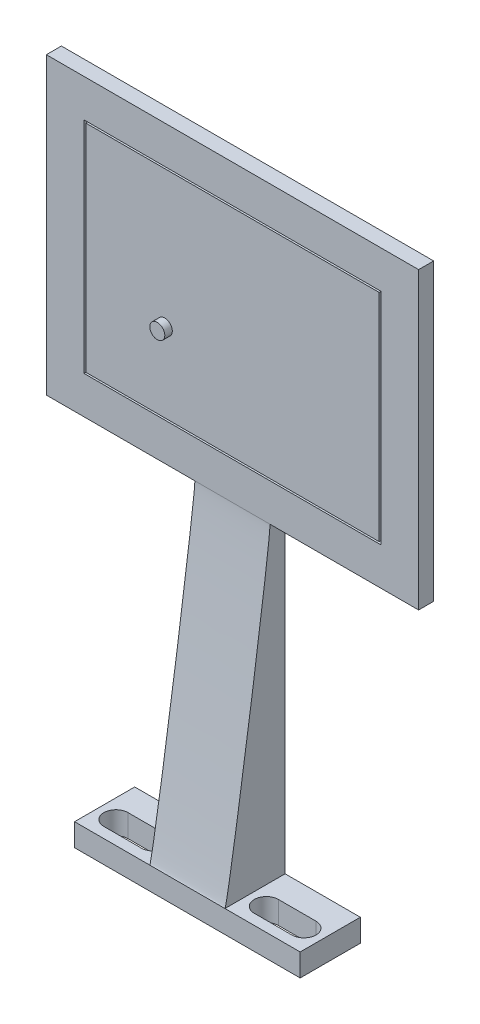
ISO-10303-21;
HEADER;
FILE_DESCRIPTION(('STEP AP214'),'2;1');
FILE_NAME('part.step','',(''),(''),'','','');
FILE_SCHEMA(('AUTOMOTIVE_DESIGN { 1 0 10303 214 1 1 1 1 }'));
ENDSEC;
DATA;
#1=APPLICATION_CONTEXT('core data for automotive mechanical design processes');
#2=APPLICATION_PROTOCOL_DEFINITION('international standard','automotive_design',2000,#1);
#3=PRODUCT_CONTEXT('',#1,'mechanical');
#4=PRODUCT('Part','Part','',(#3));
#5=PRODUCT_RELATED_PRODUCT_CATEGORY('part','',(#4));
#6=PRODUCT_DEFINITION_FORMATION('','',#4);
#7=PRODUCT_DEFINITION_CONTEXT('part definition',#1,'design');
#8=PRODUCT_DEFINITION('design','',#6,#7);
#9=PRODUCT_DEFINITION_SHAPE('','',#8);
#10=(LENGTH_UNIT() NAMED_UNIT(*) SI_UNIT(.MILLI.,.METRE.));
#11=(NAMED_UNIT(*) PLANE_ANGLE_UNIT() SI_UNIT($,.RADIAN.));
#12=(NAMED_UNIT(*) SI_UNIT($,.STERADIAN.) SOLID_ANGLE_UNIT());
#13=UNCERTAINTY_MEASURE_WITH_UNIT(LENGTH_MEASURE(1.E-05),#10,'distance_accuracy_value','');
#14=(GEOMETRIC_REPRESENTATION_CONTEXT(3) GLOBAL_UNCERTAINTY_ASSIGNED_CONTEXT((#13)) GLOBAL_UNIT_ASSIGNED_CONTEXT((#10,
#11,#12)) REPRESENTATION_CONTEXT('',''));
#15=CARTESIAN_POINT('',(0.,0.,0.));
#16=DIRECTION('',(0.,0.,1.));
#17=DIRECTION('',(1.,0.,0.));
#18=AXIS2_PLACEMENT_3D('',#15,#16,#17);
#19=CARTESIAN_POINT('',(0.,-75.2,0.));
#20=DIRECTION('',(0.,-1.,0.));
#21=DIRECTION('',(0.,0.,-1.));
#22=AXIS2_PLACEMENT_3D('',#19,#20,#21);
#23=PLANE('',#22);
#24=DIRECTION('',(-1.,0.,0.));
#25=VECTOR('',#24,1.);
#26=CARTESIAN_POINT('',(0.,-75.2,2.9));
#27=LINE('',#26,#25);
#28=CARTESIAN_POINT('',(12.,-75.2,2.9));
#29=VERTEX_POINT('',#28);
#30=CARTESIAN_POINT('',(7.00000000000001,-75.2,2.9));
#31=VERTEX_POINT('',#30);
#32=EDGE_CURVE('E556',#29,#31,#27,.T.);
#33=ORIENTED_EDGE('',*,*,#32,.F.);
#34=CARTESIAN_POINT('',(12.,-75.2,4.5));
#35=DIRECTION('',(0.,-1.,0.));
#36=DIRECTION('',(0.,0.,-1.));
#37=AXIS2_PLACEMENT_3D('',#34,#35,#36);
#38=CIRCLE('',#37,1.6);
#39=CARTESIAN_POINT('',(12.,-75.2,6.1));
#40=VERTEX_POINT('',#39);
#41=EDGE_CURVE('E264',#40,#29,#38,.F.);
#42=ORIENTED_EDGE('',*,*,#41,.F.);
#43=DIRECTION('',(1.,0.,0.));
#44=VECTOR('',#43,1.);
#45=CARTESIAN_POINT('',(0.,-75.2,6.1));
#46=LINE('',#45,#44);
#47=CARTESIAN_POINT('',(7.,-75.2,6.1));
#48=VERTEX_POINT('',#47);
#49=EDGE_CURVE('E576',#48,#40,#46,.T.);
#50=ORIENTED_EDGE('',*,*,#49,.F.);
#51=CARTESIAN_POINT('',(7.,-75.2,4.5));
#52=DIRECTION('',(0.,-1.,0.));
#53=DIRECTION('',(0.,0.,-1.));
#54=AXIS2_PLACEMENT_3D('',#51,#52,#53);
#55=CIRCLE('',#54,1.6);
#56=EDGE_CURVE('E579',#48,#31,#55,.T.);
#57=ORIENTED_EDGE('',*,*,#56,.T.);
#58=EDGE_LOOP('',(#33,#42,#50,#57));
#59=FACE_BOUND('',#58,.T.);
#60=DIRECTION('',(1.,0.,0.));
#61=VECTOR('',#60,1.);
#62=CARTESIAN_POINT('',(0.,-75.2,7.5));
#63=LINE('',#62,#61);
#64=CARTESIAN_POINT('',(4.5,-75.2,7.5));
#65=VERTEX_POINT('',#64);
#66=CARTESIAN_POINT('',(14.5,-75.2,7.5));
#67=VERTEX_POINT('',#66);
#68=EDGE_CURVE('E335',#65,#67,#63,.T.);
#69=ORIENTED_EDGE('',*,*,#68,.T.);
#70=DIRECTION('',(0.,0.,-1.));
#71=VECTOR('',#70,1.);
#72=CARTESIAN_POINT('',(14.5,-75.2,1.5));
#73=LINE('',#72,#71);
#74=CARTESIAN_POINT('',(14.5,-75.2,-0.5));
#75=VERTEX_POINT('',#74);
#76=EDGE_CURVE('E111',#67,#75,#73,.T.);
#77=ORIENTED_EDGE('',*,*,#76,.T.);
#78=DIRECTION('',(1.,0.,0.));
#79=VECTOR('',#78,1.);
#80=CARTESIAN_POINT('',(0.,-75.2,-0.5));
#81=LINE('',#80,#79);
#82=CARTESIAN_POINT('',(4.5,-75.2,-0.5));
#83=VERTEX_POINT('',#82);
#84=EDGE_CURVE('E319',#83,#75,#81,.T.);
#85=ORIENTED_EDGE('',*,*,#84,.F.);
#86=DIRECTION('',(0.,0.,-1.));
#87=VECTOR('',#86,1.);
#88=CARTESIAN_POINT('',(4.50000000000001,-75.2,0.));
#89=LINE('',#88,#87);
#90=EDGE_CURVE('E329',#65,#83,#89,.T.);
#91=ORIENTED_EDGE('',*,*,#90,.F.);
#92=EDGE_LOOP('',(#69,#77,#85,#91));
#93=FACE_BOUND('',#92,.T.);
#94=ADVANCED_FACE('F83',(#59,#93),#23,.F.);
#95=CARTESIAN_POINT('',(0.,-33.95,-0.5));
#96=DIRECTION('',(0.,-1.,0.));
#97=DIRECTION('',(0.,0.,-1.));
#98=AXIS2_PLACEMENT_3D('',#95,#96,#97);
#99=PLANE('',#98);
#100=DIRECTION('',(0.,0.,-1.));
#101=VECTOR('',#100,1.);
#102=CARTESIAN_POINT('',(14.5,-33.95,1.5));
#103=LINE('',#102,#101);
#104=CARTESIAN_POINT('',(14.5,-33.95,1.5));
#105=VERTEX_POINT('',#104);
#106=CARTESIAN_POINT('',(14.5,-33.95,-0.5));
#107=VERTEX_POINT('',#106);
#108=EDGE_CURVE('E402',#105,#107,#103,.T.);
#109=ORIENTED_EDGE('',*,*,#108,.F.);
#110=DIRECTION('',(1.,0.,0.));
#111=VECTOR('',#110,1.);
#112=CARTESIAN_POINT('',(0.,-33.95,1.5));
#113=LINE('',#112,#111);
#114=CARTESIAN_POINT('',(-5.25,-33.95,1.5));
#115=VERTEX_POINT('',#114);
#116=EDGE_CURVE('E386',#115,#105,#113,.T.);
#117=ORIENTED_EDGE('',*,*,#116,.F.);
#118=DIRECTION('',(0.,0.,1.));
#119=VECTOR('',#118,1.);
#120=CARTESIAN_POINT('',(-5.25,-33.95,-0.5));
#121=LINE('',#120,#119);
#122=CARTESIAN_POINT('',(-5.25,-33.95,-0.5));
#123=VERTEX_POINT('',#122);
#124=EDGE_CURVE('E348',#123,#115,#121,.T.);
#125=ORIENTED_EDGE('',*,*,#124,.F.);
#126=DIRECTION('',(1.,0.,0.));
#127=VECTOR('',#126,1.);
#128=CARTESIAN_POINT('',(0.,-33.95,-0.5));
#129=LINE('',#128,#127);
#130=EDGE_CURVE('E503',#123,#107,#129,.T.);
#131=ORIENTED_EDGE('',*,*,#130,.T.);
#132=EDGE_LOOP('',(#109,#117,#125,#131));
#133=FACE_BOUND('',#132,.T.);
#134=ADVANCED_FACE('F539',(#133),#99,.T.);
#135=CARTESIAN_POINT('',(0.,0.25,-0.5));
#136=DIRECTION('',(0.,-1.,0.));
#137=DIRECTION('',(0.,0.,-1.));
#138=AXIS2_PLACEMENT_3D('',#135,#136,#137);
#139=PLANE('',#138);
#140=DIRECTION('',(1.,0.,0.));
#141=VECTOR('',#140,1.);
#142=CARTESIAN_POINT('',(0.,0.25,1.5));
#143=LINE('',#142,#141);
#144=CARTESIAN_POINT('',(-0.25,0.25,1.5));
#145=VERTEX_POINT('',#144);
#146=CARTESIAN_POINT('',(39.25,0.25,1.5));
#147=VERTEX_POINT('',#146);
#148=EDGE_CURVE('E382',#145,#147,#143,.T.);
#149=ORIENTED_EDGE('',*,*,#148,.F.);
#150=DIRECTION('',(0.,0.,1.));
#151=VECTOR('',#150,1.);
#152=CARTESIAN_POINT('',(-0.25,0.25,-0.5));
#153=LINE('',#152,#151);
#154=CARTESIAN_POINT('',(-0.25,0.25,-0.5));
#155=VERTEX_POINT('',#154);
#156=EDGE_CURVE('E365',#155,#145,#153,.T.);
#157=ORIENTED_EDGE('',*,*,#156,.F.);
#158=DIRECTION('',(1.,0.,0.));
#159=VECTOR('',#158,1.);
#160=CARTESIAN_POINT('',(0.,0.25,-0.5));
#161=LINE('',#160,#159);
#162=CARTESIAN_POINT('',(39.25,0.25,-0.5));
#163=VERTEX_POINT('',#162);
#164=EDGE_CURVE('E506',#155,#163,#161,.T.);
#165=ORIENTED_EDGE('',*,*,#164,.T.);
#166=DIRECTION('',(0.,0.,1.));
#167=VECTOR('',#166,1.);
#168=CARTESIAN_POINT('',(39.25,0.25,-0.5));
#169=LINE('',#168,#167);
#170=EDGE_CURVE('E355',#163,#147,#169,.T.);
#171=ORIENTED_EDGE('',*,*,#170,.T.);
#172=EDGE_LOOP('',(#149,#157,#165,#171));
#173=FACE_BOUND('',#172,.T.);
#174=ADVANCED_FACE('F681',(#173),#139,.T.);
#175=CARTESIAN_POINT('',(-0.25,0.,-0.5));
#176=DIRECTION('',(-1.,0.,0.));
#177=DIRECTION('',(0.,-1.,0.));
#178=AXIS2_PLACEMENT_3D('',#175,#176,#177);
#179=PLANE('',#178);
#180=DIRECTION('',(0.,-1.,0.));
#181=VECTOR('',#180,1.);
#182=CARTESIAN_POINT('',(-0.25,0.,1.5));
#183=LINE('',#182,#181);
#184=CARTESIAN_POINT('',(-0.249999999999996,-28.95,1.5));
#185=VERTEX_POINT('',#184);
#186=EDGE_CURVE('E369',#145,#185,#183,.T.);
#187=ORIENTED_EDGE('',*,*,#186,.T.);
#188=DIRECTION('',(0.,0.,1.));
#189=VECTOR('',#188,1.);
#190=CARTESIAN_POINT('',(-0.249999999999996,-28.95,-0.5));
#191=LINE('',#190,#189);
#192=CARTESIAN_POINT('',(-0.249999999999996,-28.95,-0.5));
#193=VERTEX_POINT('',#192);
#194=EDGE_CURVE('E361',#193,#185,#191,.T.);
#195=ORIENTED_EDGE('',*,*,#194,.F.);
#196=DIRECTION('',(0.,-1.,0.));
#197=VECTOR('',#196,1.);
#198=CARTESIAN_POINT('',(-0.25,0.,-0.5));
#199=LINE('',#198,#197);
#200=EDGE_CURVE('E345',#155,#193,#199,.T.);
#201=ORIENTED_EDGE('',*,*,#200,.F.);
#202=ORIENTED_EDGE('',*,*,#156,.T.);
#203=EDGE_LOOP('',(#187,#195,#201,#202));
#204=FACE_BOUND('',#203,.T.);
#205=ADVANCED_FACE('F434',(#204),#179,.F.);
#206=CARTESIAN_POINT('',(0.,-28.95,-0.5));
#207=DIRECTION('',(0.,-1.,0.));
#208=DIRECTION('',(0.,0.,-1.));
#209=AXIS2_PLACEMENT_3D('',#206,#207,#208);
#210=PLANE('',#209);
#211=DIRECTION('',(1.,0.,0.));
#212=VECTOR('',#211,1.);
#213=CARTESIAN_POINT('',(0.,-28.95,1.5));
#214=LINE('',#213,#212);
#215=CARTESIAN_POINT('',(39.25,-28.95,1.5));
#216=VERTEX_POINT('',#215);
#217=EDGE_CURVE('E374',#185,#216,#214,.T.);
#218=ORIENTED_EDGE('',*,*,#217,.T.);
#219=DIRECTION('',(0.,0.,1.));
#220=VECTOR('',#219,1.);
#221=CARTESIAN_POINT('',(39.25,-28.95,-0.5));
#222=LINE('',#221,#220);
#223=CARTESIAN_POINT('',(39.25,-28.95,-0.5));
#224=VERTEX_POINT('',#223);
#225=EDGE_CURVE('E358',#224,#216,#222,.T.);
#226=ORIENTED_EDGE('',*,*,#225,.F.);
#227=DIRECTION('',(1.,0.,0.));
#228=VECTOR('',#227,1.);
#229=CARTESIAN_POINT('',(0.,-28.95,-0.5));
#230=LINE('',#229,#228);
#231=EDGE_CURVE('E514',#193,#224,#230,.T.);
#232=ORIENTED_EDGE('',*,*,#231,.F.);
#233=ORIENTED_EDGE('',*,*,#194,.T.);
#234=EDGE_LOOP('',(#218,#226,#232,#233));
#235=FACE_BOUND('',#234,.T.);
#236=ADVANCED_FACE('F942',(#235),#210,.F.);
#237=CARTESIAN_POINT('',(44.25,0.,-0.5));
#238=DIRECTION('',(-1.,0.,0.));
#239=DIRECTION('',(0.,0.,1.));
#240=AXIS2_PLACEMENT_3D('',#237,#238,#239);
#241=PLANE('',#240);
#242=DIRECTION('',(0.,-1.,0.));
#243=VECTOR('',#242,1.);
#244=CARTESIAN_POINT('',(44.25,0.,1.5));
#245=LINE('',#244,#243);
#246=CARTESIAN_POINT('',(44.25,5.25,1.5));
#247=VERTEX_POINT('',#246);
#248=CARTESIAN_POINT('',(44.25,-33.95,1.5));
#249=VERTEX_POINT('',#248);
#250=EDGE_CURVE('E492',#247,#249,#245,.T.);
#251=ORIENTED_EDGE('',*,*,#250,.T.);
#252=DIRECTION('',(0.,0.,1.));
#253=VECTOR('',#252,1.);
#254=CARTESIAN_POINT('',(44.25,-33.95,-0.5));
#255=LINE('',#254,#253);
#256=CARTESIAN_POINT('',(44.25,-33.95,-0.5));
#257=VERTEX_POINT('',#256);
#258=EDGE_CURVE('E351',#257,#249,#255,.T.);
#259=ORIENTED_EDGE('',*,*,#258,.F.);
#260=DIRECTION('',(0.,-1.,0.));
#261=VECTOR('',#260,1.);
#262=CARTESIAN_POINT('',(44.25,0.,-0.5));
#263=LINE('',#262,#261);
#264=CARTESIAN_POINT('',(44.25,5.25,-0.5));
#265=VERTEX_POINT('',#264);
#266=EDGE_CURVE('E373',#265,#257,#263,.T.);
#267=ORIENTED_EDGE('',*,*,#266,.F.);
#268=DIRECTION('',(0.,0.,1.));
#269=VECTOR('',#268,1.);
#270=CARTESIAN_POINT('',(44.25,5.25,-0.5));
#271=LINE('',#270,#269);
#272=EDGE_CURVE('E340',#265,#247,#271,.T.);
#273=ORIENTED_EDGE('',*,*,#272,.T.);
#274=EDGE_LOOP('',(#251,#259,#267,#273));
#275=FACE_BOUND('',#274,.T.);
#276=ADVANCED_FACE('F935',(#275),#241,.F.);
#277=DIRECTION('',(0.,0.,1.));
#278=VECTOR('',#277,1.);
#279=CARTESIAN_POINT('',(24.5,-33.95,1.5));
#280=LINE('',#279,#278);
#281=CARTESIAN_POINT('',(24.5,-33.95,-0.5));
#282=VERTEX_POINT('',#281);
#283=CARTESIAN_POINT('',(24.5,-33.95,1.5));
#284=VERTEX_POINT('',#283);
#285=EDGE_CURVE('E398',#282,#284,#280,.T.);
#286=ORIENTED_EDGE('',*,*,#285,.F.);
#287=EDGE_CURVE('E502',#282,#257,#129,.T.);
#288=ORIENTED_EDGE('',*,*,#287,.T.);
#289=ORIENTED_EDGE('',*,*,#258,.T.);
#290=EDGE_CURVE('E395',#284,#249,#113,.T.);
#291=ORIENTED_EDGE('',*,*,#290,.F.);
#292=EDGE_LOOP('',(#286,#288,#289,#291));
#293=FACE_BOUND('',#292,.T.);
#294=ADVANCED_FACE('F683',(#293),#99,.T.);
#295=CARTESIAN_POINT('',(-5.25,0.,-0.5));
#296=DIRECTION('',(-1.,0.,0.));
#297=DIRECTION('',(0.,-1.,0.));
#298=AXIS2_PLACEMENT_3D('',#295,#296,#297);
#299=PLANE('',#298);
#300=DIRECTION('',(0.,-1.,0.));
#301=VECTOR('',#300,1.);
#302=CARTESIAN_POINT('',(-5.25,0.,1.5));
#303=LINE('',#302,#301);
#304=CARTESIAN_POINT('',(-5.25,5.25,1.5));
#305=VERTEX_POINT('',#304);
#306=EDGE_CURVE('E389',#305,#115,#303,.T.);
#307=ORIENTED_EDGE('',*,*,#306,.F.);
#308=DIRECTION('',(0.,0.,1.));
#309=VECTOR('',#308,1.);
#310=CARTESIAN_POINT('',(-5.25,5.25,-0.5));
#311=LINE('',#310,#309);
#312=CARTESIAN_POINT('',(-5.25,5.25,-0.5));
#313=VERTEX_POINT('',#312);
#314=EDGE_CURVE('E344',#313,#305,#311,.T.);
#315=ORIENTED_EDGE('',*,*,#314,.F.);
#316=DIRECTION('',(0.,-1.,0.));
#317=VECTOR('',#316,1.);
#318=CARTESIAN_POINT('',(-5.25,0.,-0.5));
#319=LINE('',#318,#317);
#320=EDGE_CURVE('E498',#313,#123,#319,.T.);
#321=ORIENTED_EDGE('',*,*,#320,.T.);
#322=ORIENTED_EDGE('',*,*,#124,.T.);
#323=EDGE_LOOP('',(#307,#315,#321,#322));
#324=FACE_BOUND('',#323,.T.);
#325=ADVANCED_FACE('F918',(#324),#299,.T.);
#326=CARTESIAN_POINT('',(0.,5.25,-0.5));
#327=DIRECTION('',(0.,-1.,0.));
#328=DIRECTION('',(0.,0.,-1.));
#329=AXIS2_PLACEMENT_3D('',#326,#327,#328);
#330=PLANE('',#329);
#331=DIRECTION('',(1.,0.,0.));
#332=VECTOR('',#331,1.);
#333=CARTESIAN_POINT('',(0.,5.25,1.5));
#334=LINE('',#333,#332);
#335=EDGE_CURVE('E522',#305,#247,#334,.T.);
#336=ORIENTED_EDGE('',*,*,#335,.T.);
#337=ORIENTED_EDGE('',*,*,#272,.F.);
#338=DIRECTION('',(1.,0.,0.));
#339=VECTOR('',#338,1.);
#340=CARTESIAN_POINT('',(0.,5.25,-0.5));
#341=LINE('',#340,#339);
#342=EDGE_CURVE('E495',#313,#265,#341,.T.);
#343=ORIENTED_EDGE('',*,*,#342,.F.);
#344=ORIENTED_EDGE('',*,*,#314,.T.);
#345=EDGE_LOOP('',(#336,#337,#343,#344));
#346=FACE_BOUND('',#345,.T.);
#347=ADVANCED_FACE('F908',(#346),#330,.F.);
#348=CARTESIAN_POINT('',(39.25,0.,-0.5));
#349=DIRECTION('',(-1.,0.,0.));
#350=DIRECTION('',(0.,0.,1.));
#351=AXIS2_PLACEMENT_3D('',#348,#349,#350);
#352=PLANE('',#351);
#353=DIRECTION('',(0.,-1.,0.));
#354=VECTOR('',#353,1.);
#355=CARTESIAN_POINT('',(39.25,0.,1.5));
#356=LINE('',#355,#354);
#357=EDGE_CURVE('E378',#147,#216,#356,.T.);
#358=ORIENTED_EDGE('',*,*,#357,.F.);
#359=ORIENTED_EDGE('',*,*,#170,.F.);
#360=DIRECTION('',(0.,-1.,0.));
#361=VECTOR('',#360,1.);
#362=CARTESIAN_POINT('',(39.25,0.,-0.5));
#363=LINE('',#362,#361);
#364=EDGE_CURVE('E510',#163,#224,#363,.T.);
#365=ORIENTED_EDGE('',*,*,#364,.T.);
#366=ORIENTED_EDGE('',*,*,#225,.T.);
#367=EDGE_LOOP('',(#358,#359,#365,#366));
#368=FACE_BOUND('',#367,.T.);
#369=ADVANCED_FACE('F429',(#368),#352,.T.);
#370=CARTESIAN_POINT('',(0.,0.,-0.5));
#371=DIRECTION('',(0.,0.,1.));
#372=DIRECTION('',(1.,0.,0.));
#373=AXIS2_PLACEMENT_3D('',#370,#371,#372);
#374=PLANE('',#373);
#375=ORIENTED_EDGE('',*,*,#266,.T.);
#376=ORIENTED_EDGE('',*,*,#287,.F.);
#377=DIRECTION('',(0.,1.,0.));
#378=VECTOR('',#377,1.);
#379=CARTESIAN_POINT('',(24.5,-75.2,-0.5));
#380=LINE('',#379,#378);
#381=CARTESIAN_POINT('',(24.5,-75.2,-0.5));
#382=VERTEX_POINT('',#381);
#383=EDGE_CURVE('E484',#382,#282,#380,.T.);
#384=ORIENTED_EDGE('',*,*,#383,.F.);
#385=CARTESIAN_POINT('',(34.5,-75.2,-0.499999999999999));
#386=VERTEX_POINT('',#385);
#387=EDGE_CURVE('E271',#382,#386,#81,.T.);
#388=ORIENTED_EDGE('',*,*,#387,.T.);
#389=DIRECTION('',(0.,1.,0.));
#390=VECTOR('',#389,1.);
#391=CARTESIAN_POINT('',(34.5,-78.2,-0.499999999999999));
#392=LINE('',#391,#390);
#393=CARTESIAN_POINT('',(34.5,-78.2,-0.499999999999999));
#394=VERTEX_POINT('',#393);
#395=EDGE_CURVE('E267',#394,#386,#392,.T.);
#396=ORIENTED_EDGE('',*,*,#395,.F.);
#397=DIRECTION('',(1.,0.,0.));
#398=VECTOR('',#397,1.);
#399=CARTESIAN_POINT('',(0.,-78.2,-0.5));
#400=LINE('',#399,#398);
#401=CARTESIAN_POINT('',(4.5,-78.2,-0.5));
#402=VERTEX_POINT('',#401);
#403=EDGE_CURVE('E250',#402,#394,#400,.T.);
#404=ORIENTED_EDGE('',*,*,#403,.F.);
#405=DIRECTION('',(0.,1.,0.));
#406=VECTOR('',#405,1.);
#407=CARTESIAN_POINT('',(4.5,-78.2,-0.5));
#408=LINE('',#407,#406);
#409=EDGE_CURVE('E318',#402,#83,#408,.T.);
#410=ORIENTED_EDGE('',*,*,#409,.T.);
#411=ORIENTED_EDGE('',*,*,#84,.T.);
#412=DIRECTION('',(0.,1.,0.));
#413=VECTOR('',#412,1.);
#414=CARTESIAN_POINT('',(14.5,-75.2,-0.5));
#415=LINE('',#414,#413);
#416=EDGE_CURVE('E488',#75,#107,#415,.T.);
#417=ORIENTED_EDGE('',*,*,#416,.T.);
#418=ORIENTED_EDGE('',*,*,#130,.F.);
#419=ORIENTED_EDGE('',*,*,#320,.F.);
#420=ORIENTED_EDGE('',*,*,#342,.T.);
#421=EDGE_LOOP('',(#375,#376,#384,#388,#396,#404,#410,#411,#417,#418,#419,#420));
#422=FACE_BOUND('',#421,.T.);
#423=ORIENTED_EDGE('',*,*,#164,.F.);
#424=ORIENTED_EDGE('',*,*,#200,.T.);
#425=ORIENTED_EDGE('',*,*,#231,.T.);
#426=ORIENTED_EDGE('',*,*,#364,.F.);
#427=EDGE_LOOP('',(#423,#424,#425,#426));
#428=FACE_BOUND('',#427,.T.);
#429=ADVANCED_FACE('F269',(#422,#428),#374,.F.);
#430=CARTESIAN_POINT('',(0.,0.,1.5));
#431=DIRECTION('',(0.,0.,1.));
#432=DIRECTION('',(1.,0.,0.));
#433=AXIS2_PLACEMENT_3D('',#430,#431,#432);
#434=PLANE('',#433);
#435=ORIENTED_EDGE('',*,*,#116,.T.);
#436=CARTESIAN_POINT('',(25.,-33.95,1.5));
#437=CARTESIAN_POINT('',(21.3333333333333,-33.95,1.5));
#438=CARTESIAN_POINT('',(17.6666666666667,-33.95,1.5));
#439=CARTESIAN_POINT('',(14.,-33.95,1.5));
#440=(BOUNDED_CURVE() B_SPLINE_CURVE(3,(#436,#437,#438,#439),.UNSPECIFIED.,.F.,
.F.) B_SPLINE_CURVE_WITH_KNOTS((4,4),(-0.025,-0.014),
.UNSPECIFIED.) CURVE() GEOMETRIC_REPRESENTATION_ITEM() RATIONAL_B_SPLINE_CURVE((1.,1.,1.,1.)) REPRESENTATION_ITEM(''));
#441=EDGE_CURVE('E368',#105,#284,#440,.F.);
#442=ORIENTED_EDGE('',*,*,#441,.T.);
#443=ORIENTED_EDGE('',*,*,#290,.T.);
#444=ORIENTED_EDGE('',*,*,#250,.F.);
#445=ORIENTED_EDGE('',*,*,#335,.F.);
#446=ORIENTED_EDGE('',*,*,#306,.T.);
#447=EDGE_LOOP('',(#435,#442,#443,#444,#445,#446));
#448=FACE_BOUND('',#447,.T.);
#449=ORIENTED_EDGE('',*,*,#148,.T.);
#450=ORIENTED_EDGE('',*,*,#357,.T.);
#451=ORIENTED_EDGE('',*,*,#217,.F.);
#452=ORIENTED_EDGE('',*,*,#186,.F.);
#453=EDGE_LOOP('',(#449,#450,#451,#452));
#454=FACE_BOUND('',#453,.T.);
#455=ADVANCED_FACE('F424',(#448,#454),#434,.T.);
#456=CARTESIAN_POINT('',(14.5,-75.2,1.5));
#457=DIRECTION('',(1.,0.,0.));
#458=DIRECTION('',(0.,0.,-1.));
#459=AXIS2_PLACEMENT_3D('',#456,#457,#458);
#460=PLANE('',#459);
#461=ORIENTED_EDGE('',*,*,#108,.T.);
#462=ORIENTED_EDGE('',*,*,#416,.F.);
#463=ORIENTED_EDGE('',*,*,#76,.F.);
#464=CARTESIAN_POINT('',(14.5,-33.95,1.5));
#465=CARTESIAN_POINT('',(14.5,-75.2,1.5));
#466=CARTESIAN_POINT('',(14.5,-75.2,7.5));
#467=(BOUNDED_CURVE() B_SPLINE_CURVE(2,(#464,#465,#466),.UNSPECIFIED.,.F.,
.F.) B_SPLINE_CURVE_WITH_KNOTS((3,3),(0.,1.),
.UNSPECIFIED.) CURVE() GEOMETRIC_REPRESENTATION_ITEM() RATIONAL_B_SPLINE_CURVE((1.,
0.0526315789473684,1.)) REPRESENTATION_ITEM(''));
#468=EDGE_CURVE('E97',#67,#105,#467,.F.);
#469=ORIENTED_EDGE('',*,*,#468,.T.);
#470=EDGE_LOOP('',(#461,#462,#463,#469));
#471=FACE_BOUND('',#470,.T.);
#472=ADVANCED_FACE('F413',(#471),#460,.F.);
#473=CARTESIAN_POINT('',(24.5,-75.2,1.5));
#474=DIRECTION('',(-1.,0.,0.));
#475=DIRECTION('',(0.,0.,1.));
#476=AXIS2_PLACEMENT_3D('',#473,#474,#475);
#477=PLANE('',#476);
#478=ORIENTED_EDGE('',*,*,#285,.T.);
#479=CARTESIAN_POINT('',(24.5,-75.2,7.5));
#480=CARTESIAN_POINT('',(24.5,-75.2,1.5));
#481=CARTESIAN_POINT('',(24.5,-33.95,1.5));
#482=(BOUNDED_CURVE() B_SPLINE_CURVE(2,(#479,#480,#481),.UNSPECIFIED.,.F.,
.F.) B_SPLINE_CURVE_WITH_KNOTS((3,3),(0.,1.),
.UNSPECIFIED.) CURVE() GEOMETRIC_REPRESENTATION_ITEM() RATIONAL_B_SPLINE_CURVE((1.,
0.0526315789473684,1.)) REPRESENTATION_ITEM(''));
#483=CARTESIAN_POINT('',(24.5,-75.2,7.5));
#484=VERTEX_POINT('',#483);
#485=EDGE_CURVE('E14',#284,#484,#482,.F.);
#486=ORIENTED_EDGE('',*,*,#485,.T.);
#487=DIRECTION('',(0.,0.,1.));
#488=VECTOR('',#487,1.);
#489=CARTESIAN_POINT('',(24.5,-75.2,1.5));
#490=LINE('',#489,#488);
#491=EDGE_CURVE('E104',#382,#484,#490,.T.);
#492=ORIENTED_EDGE('',*,*,#491,.F.);
#493=ORIENTED_EDGE('',*,*,#383,.T.);
#494=EDGE_LOOP('',(#478,#486,#492,#493));
#495=FACE_BOUND('',#494,.T.);
#496=ADVANCED_FACE('F423',(#495),#477,.F.);
#497=DIRECTION('',(-1.,0.,0.));
#498=VECTOR('',#497,1.);
#499=CARTESIAN_POINT('',(0.,-75.2,2.9));
#500=LINE('',#499,#498);
#501=CARTESIAN_POINT('',(32.,-75.2,2.9));
#502=VERTEX_POINT('',#501);
#503=CARTESIAN_POINT('',(27.,-75.2,2.9));
#504=VERTEX_POINT('',#503);
#505=EDGE_CURVE('E547',#502,#504,#500,.T.);
#506=ORIENTED_EDGE('',*,*,#505,.F.);
#507=CARTESIAN_POINT('',(32.,-75.2,4.5));
#508=DIRECTION('',(0.,-1.,0.));
#509=DIRECTION('',(0.,0.,-1.));
#510=AXIS2_PLACEMENT_3D('',#507,#508,#509);
#511=CIRCLE('',#510,1.6);
#512=CARTESIAN_POINT('',(32.,-75.2,6.1));
#513=VERTEX_POINT('',#512);
#514=EDGE_CURVE('E554',#513,#502,#511,.F.);
#515=ORIENTED_EDGE('',*,*,#514,.F.);
#516=DIRECTION('',(1.,0.,0.));
#517=VECTOR('',#516,1.);
#518=CARTESIAN_POINT('',(0.,-75.2,6.1));
#519=LINE('',#518,#517);
#520=CARTESIAN_POINT('',(27.,-75.2,6.1));
#521=VERTEX_POINT('',#520);
#522=EDGE_CURVE('E557',#521,#513,#519,.T.);
#523=ORIENTED_EDGE('',*,*,#522,.F.);
#524=CARTESIAN_POINT('',(27.,-75.2,4.5));
#525=DIRECTION('',(0.,-1.,0.));
#526=DIRECTION('',(0.,0.,-1.));
#527=AXIS2_PLACEMENT_3D('',#524,#525,#526);
#528=CIRCLE('',#527,1.6);
#529=EDGE_CURVE('E641',#521,#504,#528,.T.);
#530=ORIENTED_EDGE('',*,*,#529,.T.);
#531=EDGE_LOOP('',(#506,#515,#523,#530));
#532=FACE_BOUND('',#531,.T.);
#533=ORIENTED_EDGE('',*,*,#491,.T.);
#534=CARTESIAN_POINT('',(34.5,-75.2,7.5));
#535=VERTEX_POINT('',#534);
#536=EDGE_CURVE('E326',#484,#535,#63,.T.);
#537=ORIENTED_EDGE('',*,*,#536,.T.);
#538=DIRECTION('',(0.,0.,-1.));
#539=VECTOR('',#538,1.);
#540=CARTESIAN_POINT('',(34.5,-75.2,0.));
#541=LINE('',#540,#539);
#542=EDGE_CURVE('E323',#535,#386,#541,.T.);
#543=ORIENTED_EDGE('',*,*,#542,.T.);
#544=ORIENTED_EDGE('',*,*,#387,.F.);
#545=EDGE_LOOP('',(#533,#537,#543,#544));
#546=FACE_BOUND('',#545,.T.);
#547=ADVANCED_FACE('F659',(#532,#546),#23,.F.);
#548=CARTESIAN_POINT('',(0.,-78.2,2.9));
#549=DIRECTION('',(0.,0.,-1.));
#550=DIRECTION('',(-1.,0.,0.));
#551=AXIS2_PLACEMENT_3D('',#548,#549,#550);
#552=PLANE('',#551);
#553=ORIENTED_EDGE('',*,*,#32,.T.);
#554=DIRECTION('',(0.,1.,0.));
#555=VECTOR('',#554,1.);
#556=CARTESIAN_POINT('',(7.00000000000001,-78.2,2.9));
#557=LINE('',#556,#555);
#558=CARTESIAN_POINT('',(7.00000000000001,-78.2,2.9));
#559=VERTEX_POINT('',#558);
#560=EDGE_CURVE('E446',#559,#31,#557,.T.);
#561=ORIENTED_EDGE('',*,*,#560,.F.);
#562=DIRECTION('',(-1.,0.,0.));
#563=VECTOR('',#562,1.);
#564=CARTESIAN_POINT('',(0.,-78.2,2.9));
#565=LINE('',#564,#563);
#566=CARTESIAN_POINT('',(12.,-78.2,2.9));
#567=VERTEX_POINT('',#566);
#568=EDGE_CURVE('E305',#567,#559,#565,.T.);
#569=ORIENTED_EDGE('',*,*,#568,.F.);
#570=DIRECTION('',(0.,1.,0.));
#571=VECTOR('',#570,1.);
#572=CARTESIAN_POINT('',(12.,-78.2,2.9));
#573=LINE('',#572,#571);
#574=EDGE_CURVE('E476',#567,#29,#573,.T.);
#575=ORIENTED_EDGE('',*,*,#574,.T.);
#576=EDGE_LOOP('',(#553,#561,#569,#575));
#577=FACE_BOUND('',#576,.T.);
#578=ADVANCED_FACE('F689',(#577),#552,.F.);
#579=CARTESIAN_POINT('',(7.,-78.2,4.5));
#580=DIRECTION('',(0.,1.,0.));
#581=DIRECTION('',(0.,0.,1.));
#582=AXIS2_PLACEMENT_3D('',#579,#580,#581);
#583=CYLINDRICAL_SURFACE('',#582,1.6);
#584=ORIENTED_EDGE('',*,*,#56,.F.);
#585=DIRECTION('',(0.,1.,0.));
#586=VECTOR('',#585,1.);
#587=CARTESIAN_POINT('',(7.,-78.2,6.1));
#588=LINE('',#587,#586);
#589=CARTESIAN_POINT('',(7.,-78.2,6.1));
#590=VERTEX_POINT('',#589);
#591=EDGE_CURVE('E451',#590,#48,#588,.T.);
#592=ORIENTED_EDGE('',*,*,#591,.F.);
#593=CARTESIAN_POINT('',(7.,-78.2,4.5));
#594=DIRECTION('',(0.,-1.,0.));
#595=DIRECTION('',(0.,0.,-1.));
#596=AXIS2_PLACEMENT_3D('',#593,#594,#595);
#597=CIRCLE('',#596,1.6);
#598=EDGE_CURVE('E308',#590,#559,#597,.T.);
#599=ORIENTED_EDGE('',*,*,#598,.T.);
#600=ORIENTED_EDGE('',*,*,#560,.T.);
#601=EDGE_LOOP('',(#584,#592,#599,#600));
#602=FACE_BOUND('',#601,.T.);
#603=ADVANCED_FACE('F693',(#602),#583,.F.);
#604=CARTESIAN_POINT('',(0.,-78.2,6.1));
#605=DIRECTION('',(0.,0.,1.));
#606=DIRECTION('',(1.,0.,0.));
#607=AXIS2_PLACEMENT_3D('',#604,#605,#606);
#608=PLANE('',#607);
#609=ORIENTED_EDGE('',*,*,#49,.T.);
#610=DIRECTION('',(0.,1.,0.));
#611=VECTOR('',#610,1.);
#612=CARTESIAN_POINT('',(12.,-78.2,6.1));
#613=LINE('',#612,#611);
#614=CARTESIAN_POINT('',(12.,-78.2,6.1));
#615=VERTEX_POINT('',#614);
#616=EDGE_CURVE('E460',#615,#40,#613,.T.);
#617=ORIENTED_EDGE('',*,*,#616,.F.);
#618=DIRECTION('',(1.,0.,0.));
#619=VECTOR('',#618,1.);
#620=CARTESIAN_POINT('',(0.,-78.2,6.1));
#621=LINE('',#620,#619);
#622=EDGE_CURVE('E312',#590,#615,#621,.T.);
#623=ORIENTED_EDGE('',*,*,#622,.F.);
#624=ORIENTED_EDGE('',*,*,#591,.T.);
#625=EDGE_LOOP('',(#609,#617,#623,#624));
#626=FACE_BOUND('',#625,.T.);
#627=ADVANCED_FACE('F674',(#626),#608,.F.);
#628=CARTESIAN_POINT('',(0.,-78.2,2.9));
#629=DIRECTION('',(0.,0.,-1.));
#630=DIRECTION('',(-1.,0.,0.));
#631=AXIS2_PLACEMENT_3D('',#628,#629,#630);
#632=PLANE('',#631);
#633=ORIENTED_EDGE('',*,*,#505,.T.);
#634=DIRECTION('',(0.,1.,0.));
#635=VECTOR('',#634,1.);
#636=CARTESIAN_POINT('',(27.,-78.2,2.9));
#637=LINE('',#636,#635);
#638=CARTESIAN_POINT('',(27.,-78.2,2.9));
#639=VERTEX_POINT('',#638);
#640=EDGE_CURVE('E473',#639,#504,#637,.T.);
#641=ORIENTED_EDGE('',*,*,#640,.F.);
#642=DIRECTION('',(-1.,0.,0.));
#643=VECTOR('',#642,1.);
#644=CARTESIAN_POINT('',(0.,-78.2,2.9));
#645=LINE('',#644,#643);
#646=CARTESIAN_POINT('',(32.,-78.2,2.9));
#647=VERTEX_POINT('',#646);
#648=EDGE_CURVE('E292',#647,#639,#645,.T.);
#649=ORIENTED_EDGE('',*,*,#648,.F.);
#650=DIRECTION('',(0.,1.,0.));
#651=VECTOR('',#650,1.);
#652=CARTESIAN_POINT('',(32.,-78.2,2.9));
#653=LINE('',#652,#651);
#654=EDGE_CURVE('E276',#647,#502,#653,.T.);
#655=ORIENTED_EDGE('',*,*,#654,.T.);
#656=EDGE_LOOP('',(#633,#641,#649,#655));
#657=FACE_BOUND('',#656,.T.);
#658=ADVANCED_FACE('F662',(#657),#632,.F.);
#659=CARTESIAN_POINT('',(27.,-78.2,4.5));
#660=DIRECTION('',(0.,1.,0.));
#661=DIRECTION('',(0.,0.,1.));
#662=AXIS2_PLACEMENT_3D('',#659,#660,#661);
#663=CYLINDRICAL_SURFACE('',#662,1.6);
#664=ORIENTED_EDGE('',*,*,#529,.F.);
#665=DIRECTION('',(0.,1.,0.));
#666=VECTOR('',#665,1.);
#667=CARTESIAN_POINT('',(27.,-78.2,6.1));
#668=LINE('',#667,#666);
#669=CARTESIAN_POINT('',(27.,-78.2,6.1));
#670=VERTEX_POINT('',#669);
#671=EDGE_CURVE('E471',#670,#521,#668,.T.);
#672=ORIENTED_EDGE('',*,*,#671,.F.);
#673=CARTESIAN_POINT('',(27.,-78.2,4.5));
#674=DIRECTION('',(0.,-1.,0.));
#675=DIRECTION('',(0.,0.,-1.));
#676=AXIS2_PLACEMENT_3D('',#673,#674,#675);
#677=CIRCLE('',#676,1.6);
#678=EDGE_CURVE('E295',#670,#639,#677,.T.);
#679=ORIENTED_EDGE('',*,*,#678,.T.);
#680=ORIENTED_EDGE('',*,*,#640,.T.);
#681=EDGE_LOOP('',(#664,#672,#679,#680));
#682=FACE_BOUND('',#681,.T.);
#683=ADVANCED_FACE('F667',(#682),#663,.F.);
#684=CARTESIAN_POINT('',(0.,-78.2,6.1));
#685=DIRECTION('',(0.,0.,1.));
#686=DIRECTION('',(1.,0.,0.));
#687=AXIS2_PLACEMENT_3D('',#684,#685,#686);
#688=PLANE('',#687);
#689=ORIENTED_EDGE('',*,*,#522,.T.);
#690=DIRECTION('',(0.,1.,0.));
#691=VECTOR('',#690,1.);
#692=CARTESIAN_POINT('',(32.,-78.2,6.1));
#693=LINE('',#692,#691);
#694=CARTESIAN_POINT('',(32.,-78.2,6.1));
#695=VERTEX_POINT('',#694);
#696=EDGE_CURVE('E467',#695,#513,#693,.T.);
#697=ORIENTED_EDGE('',*,*,#696,.F.);
#698=DIRECTION('',(1.,0.,0.));
#699=VECTOR('',#698,1.);
#700=CARTESIAN_POINT('',(0.,-78.2,6.1));
#701=LINE('',#700,#699);
#702=EDGE_CURVE('E299',#670,#695,#701,.T.);
#703=ORIENTED_EDGE('',*,*,#702,.F.);
#704=ORIENTED_EDGE('',*,*,#671,.T.);
#705=EDGE_LOOP('',(#689,#697,#703,#704));
#706=FACE_BOUND('',#705,.T.);
#707=ADVANCED_FACE('F649',(#706),#688,.F.);
#708=CARTESIAN_POINT('',(34.5,-78.2,0.));
#709=DIRECTION('',(1.,0.,0.));
#710=DIRECTION('',(0.,0.,-1.));
#711=AXIS2_PLACEMENT_3D('',#708,#709,#710);
#712=PLANE('',#711);
#713=ORIENTED_EDGE('',*,*,#542,.F.);
#714=DIRECTION('',(0.,1.,0.));
#715=VECTOR('',#714,1.);
#716=CARTESIAN_POINT('',(34.5,-78.2,7.5));
#717=LINE('',#716,#715);
#718=CARTESIAN_POINT('',(34.5,-78.2,7.5));
#719=VERTEX_POINT('',#718);
#720=EDGE_CURVE('E277',#719,#535,#717,.T.);
#721=ORIENTED_EDGE('',*,*,#720,.F.);
#722=DIRECTION('',(0.,0.,-1.));
#723=VECTOR('',#722,1.);
#724=CARTESIAN_POINT('',(34.5,-78.2,0.));
#725=LINE('',#724,#723);
#726=EDGE_CURVE('E256',#719,#394,#725,.T.);
#727=ORIENTED_EDGE('',*,*,#726,.T.);
#728=ORIENTED_EDGE('',*,*,#395,.T.);
#729=EDGE_LOOP('',(#713,#721,#727,#728));
#730=FACE_BOUND('',#729,.T.);
#731=ADVANCED_FACE('F279',(#730),#712,.T.);
#732=CARTESIAN_POINT('',(0.,-78.2,7.5));
#733=DIRECTION('',(0.,0.,1.));
#734=DIRECTION('',(1.,0.,0.));
#735=AXIS2_PLACEMENT_3D('',#732,#733,#734);
#736=PLANE('',#735);
#737=ORIENTED_EDGE('',*,*,#68,.F.);
#738=DIRECTION('',(0.,1.,0.));
#739=VECTOR('',#738,1.);
#740=CARTESIAN_POINT('',(4.5,-78.2,7.5));
#741=LINE('',#740,#739);
#742=CARTESIAN_POINT('',(4.5,-78.2,7.5));
#743=VERTEX_POINT('',#742);
#744=EDGE_CURVE('E479',#743,#65,#741,.T.);
#745=ORIENTED_EDGE('',*,*,#744,.F.);
#746=DIRECTION('',(1.,0.,0.));
#747=VECTOR('',#746,1.);
#748=CARTESIAN_POINT('',(0.,-78.2,7.5));
#749=LINE('',#748,#747);
#750=EDGE_CURVE('E282',#743,#719,#749,.T.);
#751=ORIENTED_EDGE('',*,*,#750,.T.);
#752=ORIENTED_EDGE('',*,*,#720,.T.);
#753=ORIENTED_EDGE('',*,*,#536,.F.);
#754=CARTESIAN_POINT('',(14.,-75.2,7.5));
#755=CARTESIAN_POINT('',(17.6666666666667,-75.2,7.5));
#756=CARTESIAN_POINT('',(21.3333333333333,-75.2,7.5));
#757=CARTESIAN_POINT('',(25.,-75.2,7.5));
#758=(BOUNDED_CURVE() B_SPLINE_CURVE(3,(#754,#755,#756,#757),.UNSPECIFIED.,.F.,
.F.) B_SPLINE_CURVE_WITH_KNOTS((4,4),(-0.025,-0.014),
.UNSPECIFIED.) CURVE() GEOMETRIC_REPRESENTATION_ITEM() RATIONAL_B_SPLINE_CURVE((1.,1.,1.,1.)) REPRESENTATION_ITEM(''));
#759=EDGE_CURVE('E339',#67,#484,#758,.T.);
#760=ORIENTED_EDGE('',*,*,#759,.F.);
#761=EDGE_LOOP('',(#737,#745,#751,#752,#753,#760));
#762=FACE_BOUND('',#761,.T.);
#763=ADVANCED_FACE('F736',(#762),#736,.T.);
#764=CARTESIAN_POINT('',(32.,-78.2,4.5));
#765=DIRECTION('',(0.,1.,0.));
#766=DIRECTION('',(0.,0.,1.));
#767=AXIS2_PLACEMENT_3D('',#764,#765,#766);
#768=CYLINDRICAL_SURFACE('',#767,1.6);
#769=ORIENTED_EDGE('',*,*,#514,.T.);
#770=ORIENTED_EDGE('',*,*,#654,.F.);
#771=CARTESIAN_POINT('',(32.,-78.2,4.5));
#772=DIRECTION('',(0.,-1.,0.));
#773=DIRECTION('',(0.,0.,-1.));
#774=AXIS2_PLACEMENT_3D('',#771,#772,#773);
#775=CIRCLE('',#774,1.6);
#776=EDGE_CURVE('E302',#695,#647,#775,.F.);
#777=ORIENTED_EDGE('',*,*,#776,.F.);
#778=ORIENTED_EDGE('',*,*,#696,.T.);
#779=EDGE_LOOP('',(#769,#770,#777,#778));
#780=FACE_BOUND('',#779,.T.);
#781=ADVANCED_FACE('F656',(#780),#768,.F.);
#782=CARTESIAN_POINT('',(4.50000000000001,-78.2,0.));
#783=DIRECTION('',(1.,0.,0.));
#784=DIRECTION('',(0.,0.,-1.));
#785=AXIS2_PLACEMENT_3D('',#782,#783,#784);
#786=PLANE('',#785);
#787=ORIENTED_EDGE('',*,*,#90,.T.);
#788=ORIENTED_EDGE('',*,*,#409,.F.);
#789=DIRECTION('',(0.,0.,-1.));
#790=VECTOR('',#789,1.);
#791=CARTESIAN_POINT('',(4.50000000000001,-78.2,0.));
#792=LINE('',#791,#790);
#793=EDGE_CURVE('E259',#743,#402,#792,.T.);
#794=ORIENTED_EDGE('',*,*,#793,.F.);
#795=ORIENTED_EDGE('',*,*,#744,.T.);
#796=EDGE_LOOP('',(#787,#788,#794,#795));
#797=FACE_BOUND('',#796,.T.);
#798=ADVANCED_FACE('F745',(#797),#786,.F.);
#799=CARTESIAN_POINT('',(12.,-78.2,4.5));
#800=DIRECTION('',(0.,1.,0.));
#801=DIRECTION('',(0.,0.,1.));
#802=AXIS2_PLACEMENT_3D('',#799,#800,#801);
#803=CYLINDRICAL_SURFACE('',#802,1.6);
#804=ORIENTED_EDGE('',*,*,#41,.T.);
#805=ORIENTED_EDGE('',*,*,#574,.F.);
#806=CARTESIAN_POINT('',(12.,-78.2,4.5));
#807=DIRECTION('',(0.,-1.,0.));
#808=DIRECTION('',(0.,0.,-1.));
#809=AXIS2_PLACEMENT_3D('',#806,#807,#808);
#810=CIRCLE('',#809,1.6);
#811=EDGE_CURVE('E315',#615,#567,#810,.F.);
#812=ORIENTED_EDGE('',*,*,#811,.F.);
#813=ORIENTED_EDGE('',*,*,#616,.T.);
#814=EDGE_LOOP('',(#804,#805,#812,#813));
#815=FACE_BOUND('',#814,.T.);
#816=ADVANCED_FACE('F763',(#815),#803,.F.);
#817=CARTESIAN_POINT('',(0.,-78.2,0.));
#818=DIRECTION('',(0.,-1.,0.));
#819=DIRECTION('',(0.,0.,-1.));
#820=AXIS2_PLACEMENT_3D('',#817,#818,#819);
#821=PLANE('',#820);
#822=ORIENTED_EDGE('',*,*,#403,.T.);
#823=ORIENTED_EDGE('',*,*,#726,.F.);
#824=ORIENTED_EDGE('',*,*,#750,.F.);
#825=ORIENTED_EDGE('',*,*,#793,.T.);
#826=EDGE_LOOP('',(#822,#823,#824,#825));
#827=FACE_BOUND('',#826,.T.);
#828=ORIENTED_EDGE('',*,*,#648,.T.);
#829=ORIENTED_EDGE('',*,*,#678,.F.);
#830=ORIENTED_EDGE('',*,*,#702,.T.);
#831=ORIENTED_EDGE('',*,*,#776,.T.);
#832=EDGE_LOOP('',(#828,#829,#830,#831));
#833=FACE_BOUND('',#832,.T.);
#834=ORIENTED_EDGE('',*,*,#568,.T.);
#835=ORIENTED_EDGE('',*,*,#598,.F.);
#836=ORIENTED_EDGE('',*,*,#622,.T.);
#837=ORIENTED_EDGE('',*,*,#811,.T.);
#838=EDGE_LOOP('',(#834,#835,#836,#837));
#839=FACE_BOUND('',#838,.T.);
#840=ADVANCED_FACE('F252',(#827,#833,#839),#821,.T.);
#841=CARTESIAN_POINT('',(25.,-75.2,7.5));
#842=CARTESIAN_POINT('',(21.3333333333333,-75.2,7.5));
#843=CARTESIAN_POINT('',(17.6666666666667,-75.2,7.5));
#844=CARTESIAN_POINT('',(14.,-75.2,7.5));
#845=CARTESIAN_POINT('',(25.,-75.2,1.5));
#846=CARTESIAN_POINT('',(21.3333333333333,-75.2,1.5));
#847=CARTESIAN_POINT('',(17.6666666666667,-75.2,1.5));
#848=CARTESIAN_POINT('',(14.,-75.2,1.5));
#849=CARTESIAN_POINT('',(25.,-33.95,1.5));
#850=CARTESIAN_POINT('',(21.3333333333333,-33.95,1.5));
#851=CARTESIAN_POINT('',(17.6666666666667,-33.95,1.5));
#852=CARTESIAN_POINT('',(14.,-33.95,1.5));
#853=(BOUNDED_SURFACE() B_SPLINE_SURFACE(2,3,((#841,#842,#843,#844),(#845,#846,#847,#848),(#849,
#850,#851,#852)),.UNSPECIFIED.,.F.,.F.,.F.) B_SPLINE_SURFACE_WITH_KNOTS((3,3),(4,4),(0.,1.),
(-0.025,-0.014),.UNSPECIFIED.) GEOMETRIC_REPRESENTATION_ITEM() RATIONAL_B_SPLINE_SURFACE(((1.,
1.,1.,1.),(0.0526315789473684,0.0526315789473684,0.0526315789473684,0.0526315789473684),(1.,1.,
1.,1.))) REPRESENTATION_ITEM('') SURFACE());
#854=ORIENTED_EDGE('',*,*,#485,.F.);
#855=ORIENTED_EDGE('',*,*,#441,.F.);
#856=ORIENTED_EDGE('',*,*,#468,.F.);
#857=ORIENTED_EDGE('',*,*,#759,.T.);
#858=EDGE_LOOP('',(#854,#855,#856,#857));
#859=FACE_BOUND('',#858,.T.);
#860=ADVANCED_FACE('F86',(#859),#853,.T.);
#861=CLOSED_SHELL('',(#94,#134,#174,#205,#236,#276,#294,#325,#347,#369,#429,#455,#472,#496,#547,
#578,#603,#627,#658,#683,#707,#731,#763,#781,#798,#816,#840,#860));
#862=MANIFOLD_SOLID_BREP('B2',#861);
#863=CARTESIAN_POINT('',(0.,0.,1.5));
#864=DIRECTION('',(1.,0.,0.));
#865=DIRECTION('',(0.,1.,0.));
#866=AXIS2_PLACEMENT_3D('',#863,#864,#865);
#867=PLANE('',#866);
#868=DIRECTION('',(0.,-1.,0.));
#869=VECTOR('',#868,1.);
#870=CARTESIAN_POINT('',(0.,0.,0.));
#871=LINE('',#870,#869);
#872=CARTESIAN_POINT('',(0.,0.,0.));
#873=VERTEX_POINT('',#872);
#874=CARTESIAN_POINT('',(0.,-28.7,0.));
#875=VERTEX_POINT('',#874);
#876=EDGE_CURVE('E1207',#873,#875,#871,.T.);
#877=ORIENTED_EDGE('',*,*,#876,.T.);
#878=DIRECTION('',(0.,0.,-1.));
#879=VECTOR('',#878,1.);
#880=CARTESIAN_POINT('',(0.,-28.7,1.5));
#881=LINE('',#880,#879);
#882=CARTESIAN_POINT('',(0.,-28.7,1.5));
#883=VERTEX_POINT('',#882);
#884=EDGE_CURVE('E1157',#883,#875,#881,.T.);
#885=ORIENTED_EDGE('',*,*,#884,.F.);
#886=DIRECTION('',(0.,-1.,0.));
#887=VECTOR('',#886,1.);
#888=CARTESIAN_POINT('',(0.,0.,1.5));
#889=LINE('',#888,#887);
#890=CARTESIAN_POINT('',(0.,0.,1.5));
#891=VERTEX_POINT('',#890);
#892=EDGE_CURVE('E1199',#891,#883,#889,.T.);
#893=ORIENTED_EDGE('',*,*,#892,.F.);
#894=DIRECTION('',(0.,0.,-1.));
#895=VECTOR('',#894,1.);
#896=CARTESIAN_POINT('',(0.,0.,1.5));
#897=LINE('',#896,#895);
#898=EDGE_CURVE('E81',#891,#873,#897,.T.);
#899=ORIENTED_EDGE('',*,*,#898,.T.);
#900=EDGE_LOOP('',(#877,#885,#893,#899));
#901=FACE_BOUND('',#900,.T.);
#902=ADVANCED_FACE('F1148',(#901),#867,.F.);
#903=CARTESIAN_POINT('',(0.,-28.7,1.5));
#904=DIRECTION('',(0.,1.,0.));
#905=DIRECTION('',(0.,0.,1.));
#906=AXIS2_PLACEMENT_3D('',#903,#904,#905);
#907=PLANE('',#906);
#908=DIRECTION('',(1.,0.,0.));
#909=VECTOR('',#908,1.);
#910=CARTESIAN_POINT('',(0.,-28.7,0.));
#911=LINE('',#910,#909);
#912=CARTESIAN_POINT('',(39.,-28.7,0.));
#913=VERTEX_POINT('',#912);
#914=EDGE_CURVE('E1214',#875,#913,#911,.T.);
#915=ORIENTED_EDGE('',*,*,#914,.T.);
#916=DIRECTION('',(0.,0.,-1.));
#917=VECTOR('',#916,1.);
#918=CARTESIAN_POINT('',(39.,-28.7,1.5));
#919=LINE('',#918,#917);
#920=CARTESIAN_POINT('',(39.,-28.7,1.5));
#921=VERTEX_POINT('',#920);
#922=EDGE_CURVE('E1179',#921,#913,#919,.T.);
#923=ORIENTED_EDGE('',*,*,#922,.F.);
#924=DIRECTION('',(1.,0.,0.));
#925=VECTOR('',#924,1.);
#926=CARTESIAN_POINT('',(0.,-28.7,1.5));
#927=LINE('',#926,#925);
#928=EDGE_CURVE('E1191',#883,#921,#927,.T.);
#929=ORIENTED_EDGE('',*,*,#928,.F.);
#930=ORIENTED_EDGE('',*,*,#884,.T.);
#931=EDGE_LOOP('',(#915,#923,#929,#930));
#932=FACE_BOUND('',#931,.T.);
#933=ADVANCED_FACE('F1193',(#932),#907,.F.);
#934=CARTESIAN_POINT('',(39.,0.,1.5));
#935=DIRECTION('',(1.,0.,0.));
#936=DIRECTION('',(0.,1.,0.));
#937=AXIS2_PLACEMENT_3D('',#934,#935,#936);
#938=PLANE('',#937);
#939=DIRECTION('',(0.,-1.,0.));
#940=VECTOR('',#939,1.);
#941=CARTESIAN_POINT('',(39.,0.,0.));
#942=LINE('',#941,#940);
#943=CARTESIAN_POINT('',(39.,0.,0.));
#944=VERTEX_POINT('',#943);
#945=EDGE_CURVE('E1211',#944,#913,#942,.T.);
#946=ORIENTED_EDGE('',*,*,#945,.F.);
#947=DIRECTION('',(0.,0.,-1.));
#948=VECTOR('',#947,1.);
#949=CARTESIAN_POINT('',(39.,0.,1.5));
#950=LINE('',#949,#948);
#951=CARTESIAN_POINT('',(39.,0.,1.5));
#952=VERTEX_POINT('',#951);
#953=EDGE_CURVE('E1165',#952,#944,#950,.T.);
#954=ORIENTED_EDGE('',*,*,#953,.F.);
#955=DIRECTION('',(0.,-1.,0.));
#956=VECTOR('',#955,1.);
#957=CARTESIAN_POINT('',(39.,0.,1.5));
#958=LINE('',#957,#956);
#959=EDGE_CURVE('E1198',#952,#921,#958,.T.);
#960=ORIENTED_EDGE('',*,*,#959,.T.);
#961=ORIENTED_EDGE('',*,*,#922,.T.);
#962=EDGE_LOOP('',(#946,#954,#960,#961));
#963=FACE_BOUND('',#962,.T.);
#964=ADVANCED_FACE('F1248',(#963),#938,.T.);
#965=CARTESIAN_POINT('',(0.,0.,1.5));
#966=DIRECTION('',(0.,1.,0.));
#967=DIRECTION('',(0.,0.,1.));
#968=AXIS2_PLACEMENT_3D('',#965,#966,#967);
#969=PLANE('',#968);
#970=DIRECTION('',(1.,0.,0.));
#971=VECTOR('',#970,1.);
#972=CARTESIAN_POINT('',(0.,0.,0.));
#973=LINE('',#972,#971);
#974=EDGE_CURVE('E1217',#873,#944,#973,.T.);
#975=ORIENTED_EDGE('',*,*,#974,.F.);
#976=ORIENTED_EDGE('',*,*,#898,.F.);
#977=DIRECTION('',(1.,0.,0.));
#978=VECTOR('',#977,1.);
#979=CARTESIAN_POINT('',(0.,0.,1.5));
#980=LINE('',#979,#978);
#981=EDGE_CURVE('E1203',#891,#952,#980,.T.);
#982=ORIENTED_EDGE('',*,*,#981,.T.);
#983=ORIENTED_EDGE('',*,*,#953,.T.);
#984=EDGE_LOOP('',(#975,#976,#982,#983));
#985=FACE_BOUND('',#984,.T.);
#986=ADVANCED_FACE('F1150',(#985),#969,.T.);
#987=CARTESIAN_POINT('',(0.,0.,0.));
#988=DIRECTION('',(0.,0.,1.));
#989=DIRECTION('',(1.,0.,0.));
#990=AXIS2_PLACEMENT_3D('',#987,#988,#989);
#991=PLANE('',#990);
#992=ORIENTED_EDGE('',*,*,#974,.T.);
#993=ORIENTED_EDGE('',*,*,#945,.T.);
#994=ORIENTED_EDGE('',*,*,#914,.F.);
#995=ORIENTED_EDGE('',*,*,#876,.F.);
#996=EDGE_LOOP('',(#992,#993,#994,#995));
#997=FACE_BOUND('',#996,.T.);
#998=ADVANCED_FACE('F1237',(#997),#991,.F.);
#999=CARTESIAN_POINT('',(0.,0.,1.5));
#1000=DIRECTION('',(0.,0.,1.));
#1001=DIRECTION('',(1.,0.,0.));
#1002=AXIS2_PLACEMENT_3D('',#999,#1000,#1001);
#1003=PLANE('',#1002);
#1004=CARTESIAN_POINT('',(10.5,-18.2,1.5));
#1005=DIRECTION('',(0.,0.,1.));
#1006=DIRECTION('',(1.,0.,0.));
#1007=AXIS2_PLACEMENT_3D('',#1004,#1005,#1006);
#1008=CIRCLE('',#1007,1.);
#1009=CARTESIAN_POINT('',(11.5,-18.2,1.5));
#1010=VERTEX_POINT('',#1009);
#1011=EDGE_CURVE('E1222',#1010,#1010,#1008,.T.);
#1012=ORIENTED_EDGE('',*,*,#1011,.F.);
#1013=EDGE_LOOP('',(#1012));
#1014=FACE_BOUND('',#1013,.T.);
#1015=ORIENTED_EDGE('',*,*,#981,.F.);
#1016=ORIENTED_EDGE('',*,*,#892,.T.);
#1017=ORIENTED_EDGE('',*,*,#928,.T.);
#1018=ORIENTED_EDGE('',*,*,#959,.F.);
#1019=EDGE_LOOP('',(#1015,#1016,#1017,#1018));
#1020=FACE_BOUND('',#1019,.T.);
#1021=ADVANCED_FACE('F1202',(#1014,#1020),#1003,.T.);
#1022=CARTESIAN_POINT('',(10.5,-18.2,2.5));
#1023=DIRECTION('',(0.,0.,-1.));
#1024=DIRECTION('',(-1.,0.,0.));
#1025=AXIS2_PLACEMENT_3D('',#1022,#1023,#1024);
#1026=CYLINDRICAL_SURFACE('',#1025,1.);
#1027=CARTESIAN_POINT('',(10.5,-18.2,2.5));
#1028=DIRECTION('',(0.,0.,1.));
#1029=DIRECTION('',(1.,0.,0.));
#1030=AXIS2_PLACEMENT_3D('',#1027,#1028,#1029);
#1031=CIRCLE('',#1030,1.);
#1032=CARTESIAN_POINT('',(11.5,-18.2,2.5));
#1033=VERTEX_POINT('',#1032);
#1034=EDGE_CURVE('E1219',#1033,#1033,#1031,.T.);
#1035=ORIENTED_EDGE('',*,*,#1034,.F.);
#1036=EDGE_LOOP('',(#1035));
#1037=FACE_BOUND('',#1036,.T.);
#1038=ORIENTED_EDGE('',*,*,#1011,.T.);
#1039=EDGE_LOOP('',(#1038));
#1040=FACE_BOUND('',#1039,.T.);
#1041=ADVANCED_FACE('F1230',(#1037,#1040),#1026,.T.);
#1042=CARTESIAN_POINT('',(0.,0.,2.5));
#1043=DIRECTION('',(0.,0.,1.));
#1044=DIRECTION('',(1.,0.,0.));
#1045=AXIS2_PLACEMENT_3D('',#1042,#1043,#1044);
#1046=PLANE('',#1045);
#1047=ORIENTED_EDGE('',*,*,#1034,.T.);
#1048=EDGE_LOOP('',(#1047));
#1049=FACE_BOUND('',#1048,.T.);
#1050=ADVANCED_FACE('F1228',(#1049),#1046,.T.);
#1051=CLOSED_SHELL('',(#902,#933,#964,#986,#998,#1021,#1041,#1050));
#1052=MANIFOLD_SOLID_BREP('B8_NOT_SHOWN',#1051);
#1053=ADVANCED_BREP_SHAPE_REPRESENTATION('',(#18,#862,#1052),#14);
#1054=SHAPE_DEFINITION_REPRESENTATION(#9,#1053);
ENDSEC;
END-ISO-10303-21;
